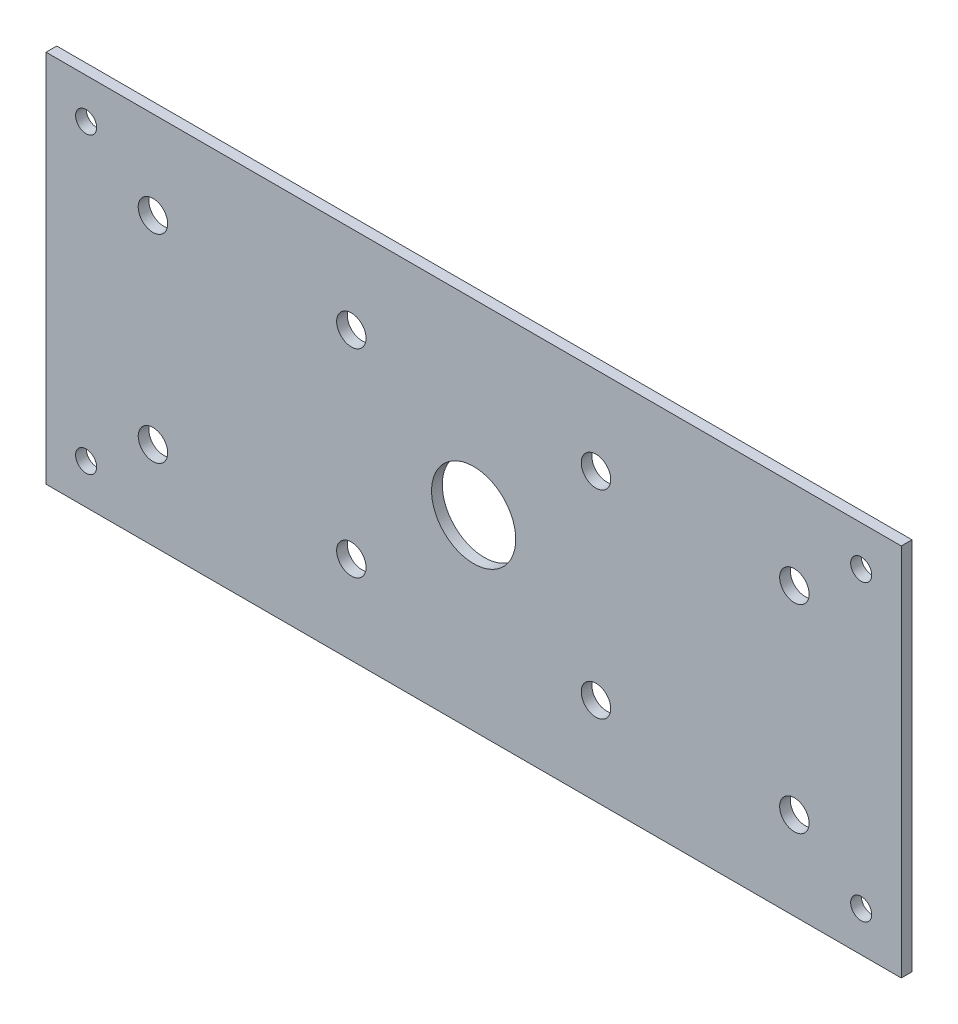
ISO-10303-21;
HEADER;
FILE_DESCRIPTION(('STEP AP214'),'2;1');
FILE_NAME('part.step','',(''),(''),'','','');
FILE_SCHEMA(('AUTOMOTIVE_DESIGN { 1 0 10303 214 1 1 1 1 }'));
ENDSEC;
DATA;
#1=APPLICATION_CONTEXT('core data for automotive mechanical design processes');
#2=APPLICATION_PROTOCOL_DEFINITION('international standard','automotive_design',2000,#1);
#3=PRODUCT_CONTEXT('',#1,'mechanical');
#4=PRODUCT('Part','Part','',(#3));
#5=PRODUCT_RELATED_PRODUCT_CATEGORY('part','',(#4));
#6=PRODUCT_DEFINITION_FORMATION('','',#4);
#7=PRODUCT_DEFINITION_CONTEXT('part definition',#1,'design');
#8=PRODUCT_DEFINITION('design','',#6,#7);
#9=PRODUCT_DEFINITION_SHAPE('','',#8);
#10=(LENGTH_UNIT() NAMED_UNIT(*) SI_UNIT(.MILLI.,.METRE.));
#11=(NAMED_UNIT(*) PLANE_ANGLE_UNIT() SI_UNIT($,.RADIAN.));
#12=(NAMED_UNIT(*) SI_UNIT($,.STERADIAN.) SOLID_ANGLE_UNIT());
#13=UNCERTAINTY_MEASURE_WITH_UNIT(LENGTH_MEASURE(1.E-05),#10,'distance_accuracy_value','');
#14=(GEOMETRIC_REPRESENTATION_CONTEXT(3) GLOBAL_UNCERTAINTY_ASSIGNED_CONTEXT((#13)) GLOBAL_UNIT_ASSIGNED_CONTEXT((#10,
#11,#12)) REPRESENTATION_CONTEXT('',''));
#15=CARTESIAN_POINT('',(0.,0.,0.));
#16=DIRECTION('',(0.,0.,1.));
#17=DIRECTION('',(1.,0.,0.));
#18=AXIS2_PLACEMENT_3D('',#15,#16,#17);
#19=CARTESIAN_POINT('',(0.,0.,1.27));
#20=DIRECTION('',(0.,0.,-1.));
#21=DIRECTION('',(-1.,0.,0.));
#22=AXIS2_PLACEMENT_3D('',#19,#20,#21);
#23=PLANE('',#22);
#24=CARTESIAN_POINT('',(-92.075,34.925,1.27));
#25=DIRECTION('',(0.,0.,1.));
#26=DIRECTION('',(1.,0.,0.));
#27=AXIS2_PLACEMENT_3D('',#24,#25,#26);
#28=CIRCLE('',#27,2.5);
#29=CARTESIAN_POINT('',(-89.575,34.925,1.27));
#30=VERTEX_POINT('',#29);
#31=EDGE_CURVE('E219',#30,#30,#28,.T.);
#32=ORIENTED_EDGE('',*,*,#31,.F.);
#33=EDGE_LOOP('',(#32));
#34=FACE_BOUND('',#33,.T.);
#35=CARTESIAN_POINT('',(92.075,-34.925,1.27));
#36=DIRECTION('',(0.,0.,1.));
#37=DIRECTION('',(1.,0.,0.));
#38=AXIS2_PLACEMENT_3D('',#35,#36,#37);
#39=CIRCLE('',#38,2.5);
#40=CARTESIAN_POINT('',(94.575,-34.925,1.27));
#41=VERTEX_POINT('',#40);
#42=EDGE_CURVE('E210',#41,#41,#39,.T.);
#43=ORIENTED_EDGE('',*,*,#42,.F.);
#44=EDGE_LOOP('',(#43));
#45=FACE_BOUND('',#44,.T.);
#46=CARTESIAN_POINT('',(92.075,34.925,1.27));
#47=DIRECTION('',(0.,0.,1.));
#48=DIRECTION('',(1.,0.,0.));
#49=AXIS2_PLACEMENT_3D('',#46,#47,#48);
#50=CIRCLE('',#49,2.50000000000001);
#51=CARTESIAN_POINT('',(94.575,34.925,1.27));
#52=VERTEX_POINT('',#51);
#53=EDGE_CURVE('E226',#52,#52,#50,.T.);
#54=ORIENTED_EDGE('',*,*,#53,.F.);
#55=EDGE_LOOP('',(#54));
#56=FACE_BOUND('',#55,.T.);
#57=CARTESIAN_POINT('',(-92.075,-34.925,1.27));
#58=DIRECTION('',(0.,0.,1.));
#59=DIRECTION('',(1.,0.,0.));
#60=AXIS2_PLACEMENT_3D('',#57,#58,#59);
#61=CIRCLE('',#60,2.5);
#62=CARTESIAN_POINT('',(-89.575,-34.925,1.27));
#63=VERTEX_POINT('',#62);
#64=EDGE_CURVE('E202',#63,#63,#61,.T.);
#65=ORIENTED_EDGE('',*,*,#64,.F.);
#66=EDGE_LOOP('',(#65));
#67=FACE_BOUND('',#66,.T.);
#68=DIRECTION('',(0.,1.,0.));
#69=VECTOR('',#68,1.);
#70=CARTESIAN_POINT('',(101.6,-44.45,1.27));
#71=LINE('',#70,#69);
#72=CARTESIAN_POINT('',(101.6,-44.45,1.27));
#73=VERTEX_POINT('',#72);
#74=CARTESIAN_POINT('',(101.6,44.45,1.27));
#75=VERTEX_POINT('',#74);
#76=EDGE_CURVE('E92',#73,#75,#71,.T.);
#77=ORIENTED_EDGE('',*,*,#76,.T.);
#78=DIRECTION('',(-1.,0.,0.));
#79=VECTOR('',#78,1.);
#80=CARTESIAN_POINT('',(-101.6,44.45,1.27));
#81=LINE('',#80,#79);
#82=CARTESIAN_POINT('',(-101.6,44.45,1.27));
#83=VERTEX_POINT('',#82);
#84=EDGE_CURVE('E87',#75,#83,#81,.T.);
#85=ORIENTED_EDGE('',*,*,#84,.T.);
#86=DIRECTION('',(0.,-1.,0.));
#87=VECTOR('',#86,1.);
#88=CARTESIAN_POINT('',(-101.6,-44.45,1.27));
#89=LINE('',#88,#87);
#90=CARTESIAN_POINT('',(-101.6,-44.45,1.27));
#91=VERTEX_POINT('',#90);
#92=EDGE_CURVE('E90',#83,#91,#89,.T.);
#93=ORIENTED_EDGE('',*,*,#92,.T.);
#94=DIRECTION('',(1.,0.,0.));
#95=VECTOR('',#94,1.);
#96=CARTESIAN_POINT('',(-101.6,-44.45,1.27));
#97=LINE('',#96,#95);
#98=EDGE_CURVE('E57',#91,#73,#97,.T.);
#99=ORIENTED_EDGE('',*,*,#98,.T.);
#100=EDGE_LOOP('',(#77,#85,#93,#99));
#101=FACE_BOUND('',#100,.T.);
#102=CARTESIAN_POINT('',(-76.2,23.57,1.27));
#103=DIRECTION('',(0.,0.,1.));
#104=DIRECTION('',(1.,0.,0.));
#105=AXIS2_PLACEMENT_3D('',#102,#103,#104);
#106=CIRCLE('',#105,3.50000000000001);
#107=CARTESIAN_POINT('',(-72.7,23.57,1.27));
#108=VERTEX_POINT('',#107);
#109=EDGE_CURVE('E112',#108,#108,#106,.T.);
#110=ORIENTED_EDGE('',*,*,#109,.F.);
#111=EDGE_LOOP('',(#110));
#112=FACE_BOUND('',#111,.T.);
#113=CARTESIAN_POINT('',(-29.06,23.57,1.27));
#114=DIRECTION('',(0.,0.,1.));
#115=DIRECTION('',(1.,0.,0.));
#116=AXIS2_PLACEMENT_3D('',#113,#114,#115);
#117=CIRCLE('',#116,3.5);
#118=CARTESIAN_POINT('',(-25.56,23.57,1.27));
#119=VERTEX_POINT('',#118);
#120=EDGE_CURVE('E134',#119,#119,#117,.T.);
#121=ORIENTED_EDGE('',*,*,#120,.F.);
#122=EDGE_LOOP('',(#121));
#123=FACE_BOUND('',#122,.T.);
#124=CARTESIAN_POINT('',(-29.06,-23.57,1.27));
#125=DIRECTION('',(0.,0.,1.));
#126=DIRECTION('',(1.,0.,0.));
#127=AXIS2_PLACEMENT_3D('',#124,#125,#126);
#128=CIRCLE('',#127,3.5);
#129=CARTESIAN_POINT('',(-25.56,-23.57,1.27));
#130=VERTEX_POINT('',#129);
#131=EDGE_CURVE('E142',#130,#130,#128,.T.);
#132=ORIENTED_EDGE('',*,*,#131,.F.);
#133=EDGE_LOOP('',(#132));
#134=FACE_BOUND('',#133,.T.);
#135=CARTESIAN_POINT('',(-76.2,-23.57,1.27));
#136=DIRECTION('',(0.,0.,1.));
#137=DIRECTION('',(1.,0.,0.));
#138=AXIS2_PLACEMENT_3D('',#135,#136,#137);
#139=CIRCLE('',#138,3.50000000000001);
#140=CARTESIAN_POINT('',(-72.7,-23.57,1.27));
#141=VERTEX_POINT('',#140);
#142=EDGE_CURVE('E150',#141,#141,#139,.T.);
#143=ORIENTED_EDGE('',*,*,#142,.F.);
#144=EDGE_LOOP('',(#143));
#145=FACE_BOUND('',#144,.T.);
#146=CARTESIAN_POINT('',(29.06,-23.57,1.27));
#147=DIRECTION('',(0.,0.,1.));
#148=DIRECTION('',(1.,0.,0.));
#149=AXIS2_PLACEMENT_3D('',#146,#147,#148);
#150=CIRCLE('',#149,3.5);
#151=CARTESIAN_POINT('',(32.56,-23.57,1.27));
#152=VERTEX_POINT('',#151);
#153=EDGE_CURVE('E158',#152,#152,#150,.T.);
#154=ORIENTED_EDGE('',*,*,#153,.F.);
#155=EDGE_LOOP('',(#154));
#156=FACE_BOUND('',#155,.T.);
#157=CARTESIAN_POINT('',(76.2,-23.57,1.27));
#158=DIRECTION('',(0.,0.,1.));
#159=DIRECTION('',(1.,0.,0.));
#160=AXIS2_PLACEMENT_3D('',#157,#158,#159);
#161=CIRCLE('',#160,3.50000000000001);
#162=CARTESIAN_POINT('',(79.7,-23.57,1.27));
#163=VERTEX_POINT('',#162);
#164=EDGE_CURVE('E166',#163,#163,#161,.T.);
#165=ORIENTED_EDGE('',*,*,#164,.F.);
#166=EDGE_LOOP('',(#165));
#167=FACE_BOUND('',#166,.T.);
#168=CARTESIAN_POINT('',(76.2,23.57,1.27));
#169=DIRECTION('',(0.,0.,1.));
#170=DIRECTION('',(1.,0.,0.));
#171=AXIS2_PLACEMENT_3D('',#168,#169,#170);
#172=CIRCLE('',#171,3.50000000000001);
#173=CARTESIAN_POINT('',(79.7,23.57,1.27));
#174=VERTEX_POINT('',#173);
#175=EDGE_CURVE('E174',#174,#174,#172,.T.);
#176=ORIENTED_EDGE('',*,*,#175,.F.);
#177=EDGE_LOOP('',(#176));
#178=FACE_BOUND('',#177,.T.);
#179=CARTESIAN_POINT('',(29.06,23.57,1.27));
#180=DIRECTION('',(0.,0.,1.));
#181=DIRECTION('',(1.,0.,0.));
#182=AXIS2_PLACEMENT_3D('',#179,#180,#181);
#183=CIRCLE('',#182,3.5);
#184=CARTESIAN_POINT('',(32.56,23.57,1.27));
#185=VERTEX_POINT('',#184);
#186=EDGE_CURVE('E182',#185,#185,#183,.T.);
#187=ORIENTED_EDGE('',*,*,#186,.F.);
#188=EDGE_LOOP('',(#187));
#189=FACE_BOUND('',#188,.T.);
#190=CARTESIAN_POINT('',(0.,0.,1.27));
#191=DIRECTION('',(0.,0.,1.));
#192=DIRECTION('',(1.,0.,0.));
#193=AXIS2_PLACEMENT_3D('',#190,#191,#192);
#194=CIRCLE('',#193,10.);
#195=CARTESIAN_POINT('',(9.99999999999999,0.,1.27));
#196=VERTEX_POINT('',#195);
#197=EDGE_CURVE('E190',#196,#196,#194,.T.);
#198=ORIENTED_EDGE('',*,*,#197,.F.);
#199=EDGE_LOOP('',(#198));
#200=FACE_BOUND('',#199,.T.);
#201=ADVANCED_FACE('F39',(#34,#45,#56,#67,#101,#112,#123,#134,#145,#156,#167,#178,#189,#200),
#23,.F.);
#202=CARTESIAN_POINT('',(0.,0.,-1.27));
#203=DIRECTION('',(0.,0.,-1.));
#204=DIRECTION('',(-1.,0.,0.));
#205=AXIS2_PLACEMENT_3D('',#202,#203,#204);
#206=PLANE('',#205);
#207=CARTESIAN_POINT('',(-92.075,34.925,-1.27));
#208=DIRECTION('',(0.,0.,1.));
#209=DIRECTION('',(1.,0.,0.));
#210=AXIS2_PLACEMENT_3D('',#207,#208,#209);
#211=CIRCLE('',#210,2.5);
#212=CARTESIAN_POINT('',(-89.575,34.925,-1.27));
#213=VERTEX_POINT('',#212);
#214=EDGE_CURVE('E206',#213,#213,#211,.T.);
#215=ORIENTED_EDGE('',*,*,#214,.T.);
#216=EDGE_LOOP('',(#215));
#217=FACE_BOUND('',#216,.T.);
#218=CARTESIAN_POINT('',(92.075,-34.925,-1.27));
#219=DIRECTION('',(0.,0.,1.));
#220=DIRECTION('',(1.,0.,0.));
#221=AXIS2_PLACEMENT_3D('',#218,#219,#220);
#222=CIRCLE('',#221,2.5);
#223=CARTESIAN_POINT('',(94.575,-34.925,-1.27));
#224=VERTEX_POINT('',#223);
#225=EDGE_CURVE('E214',#224,#224,#222,.T.);
#226=ORIENTED_EDGE('',*,*,#225,.T.);
#227=EDGE_LOOP('',(#226));
#228=FACE_BOUND('',#227,.T.);
#229=CARTESIAN_POINT('',(92.075,34.925,-1.27));
#230=DIRECTION('',(0.,0.,1.));
#231=DIRECTION('',(1.,0.,0.));
#232=AXIS2_PLACEMENT_3D('',#229,#230,#231);
#233=CIRCLE('',#232,2.50000000000001);
#234=CARTESIAN_POINT('',(94.575,34.925,-1.27));
#235=VERTEX_POINT('',#234);
#236=EDGE_CURVE('E215',#235,#235,#233,.T.);
#237=ORIENTED_EDGE('',*,*,#236,.T.);
#238=EDGE_LOOP('',(#237));
#239=FACE_BOUND('',#238,.T.);
#240=CARTESIAN_POINT('',(-92.075,-34.925,-1.27));
#241=DIRECTION('',(0.,0.,1.));
#242=DIRECTION('',(1.,0.,0.));
#243=AXIS2_PLACEMENT_3D('',#240,#241,#242);
#244=CIRCLE('',#243,2.5);
#245=CARTESIAN_POINT('',(-89.575,-34.925,-1.27));
#246=VERTEX_POINT('',#245);
#247=EDGE_CURVE('E198',#246,#246,#244,.T.);
#248=ORIENTED_EDGE('',*,*,#247,.T.);
#249=EDGE_LOOP('',(#248));
#250=FACE_BOUND('',#249,.T.);
#251=CARTESIAN_POINT('',(29.06,23.57,-1.27));
#252=DIRECTION('',(0.,0.,1.));
#253=DIRECTION('',(1.,0.,0.));
#254=AXIS2_PLACEMENT_3D('',#251,#252,#253);
#255=CIRCLE('',#254,3.5);
#256=CARTESIAN_POINT('',(32.56,23.57,-1.27));
#257=VERTEX_POINT('',#256);
#258=EDGE_CURVE('E186',#257,#257,#255,.T.);
#259=ORIENTED_EDGE('',*,*,#258,.T.);
#260=EDGE_LOOP('',(#259));
#261=FACE_BOUND('',#260,.T.);
#262=CARTESIAN_POINT('',(76.2,-23.57,-1.27));
#263=DIRECTION('',(0.,0.,1.));
#264=DIRECTION('',(1.,0.,0.));
#265=AXIS2_PLACEMENT_3D('',#262,#263,#264);
#266=CIRCLE('',#265,3.50000000000001);
#267=CARTESIAN_POINT('',(79.7,-23.57,-1.27));
#268=VERTEX_POINT('',#267);
#269=EDGE_CURVE('E170',#268,#268,#266,.T.);
#270=ORIENTED_EDGE('',*,*,#269,.T.);
#271=EDGE_LOOP('',(#270));
#272=FACE_BOUND('',#271,.T.);
#273=CARTESIAN_POINT('',(-76.2,-23.57,-1.27));
#274=DIRECTION('',(0.,0.,1.));
#275=DIRECTION('',(1.,0.,0.));
#276=AXIS2_PLACEMENT_3D('',#273,#274,#275);
#277=CIRCLE('',#276,3.50000000000001);
#278=CARTESIAN_POINT('',(-72.7,-23.57,-1.27));
#279=VERTEX_POINT('',#278);
#280=EDGE_CURVE('E154',#279,#279,#277,.T.);
#281=ORIENTED_EDGE('',*,*,#280,.T.);
#282=EDGE_LOOP('',(#281));
#283=FACE_BOUND('',#282,.T.);
#284=CARTESIAN_POINT('',(-29.06,23.57,-1.27));
#285=DIRECTION('',(0.,0.,1.));
#286=DIRECTION('',(1.,0.,0.));
#287=AXIS2_PLACEMENT_3D('',#284,#285,#286);
#288=CIRCLE('',#287,3.5);
#289=CARTESIAN_POINT('',(-25.56,23.57,-1.27));
#290=VERTEX_POINT('',#289);
#291=EDGE_CURVE('E138',#290,#290,#288,.T.);
#292=ORIENTED_EDGE('',*,*,#291,.T.);
#293=EDGE_LOOP('',(#292));
#294=FACE_BOUND('',#293,.T.);
#295=DIRECTION('',(0.,1.,0.));
#296=VECTOR('',#295,1.);
#297=CARTESIAN_POINT('',(101.6,-44.45,-1.27));
#298=LINE('',#297,#296);
#299=CARTESIAN_POINT('',(101.6,-44.45,-1.27));
#300=VERTEX_POINT('',#299);
#301=CARTESIAN_POINT('',(101.6,44.45,-1.27));
#302=VERTEX_POINT('',#301);
#303=EDGE_CURVE('E108',#300,#302,#298,.T.);
#304=ORIENTED_EDGE('',*,*,#303,.F.);
#305=DIRECTION('',(1.,0.,0.));
#306=VECTOR('',#305,1.);
#307=CARTESIAN_POINT('',(-101.6,-44.45,-1.27));
#308=LINE('',#307,#306);
#309=CARTESIAN_POINT('',(-101.6,-44.45,-1.27));
#310=VERTEX_POINT('',#309);
#311=EDGE_CURVE('E80',#310,#300,#308,.T.);
#312=ORIENTED_EDGE('',*,*,#311,.F.);
#313=DIRECTION('',(0.,-1.,0.));
#314=VECTOR('',#313,1.);
#315=CARTESIAN_POINT('',(-101.6,-44.45,-1.27));
#316=LINE('',#315,#314);
#317=CARTESIAN_POINT('',(-101.6,44.45,-1.27));
#318=VERTEX_POINT('',#317);
#319=EDGE_CURVE('E74',#318,#310,#316,.T.);
#320=ORIENTED_EDGE('',*,*,#319,.F.);
#321=DIRECTION('',(-1.,0.,0.));
#322=VECTOR('',#321,1.);
#323=CARTESIAN_POINT('',(-101.6,44.45,-1.27));
#324=LINE('',#323,#322);
#325=EDGE_CURVE('E97',#302,#318,#324,.T.);
#326=ORIENTED_EDGE('',*,*,#325,.F.);
#327=EDGE_LOOP('',(#304,#312,#320,#326));
#328=FACE_BOUND('',#327,.T.);
#329=CARTESIAN_POINT('',(-76.2,23.57,-1.27));
#330=DIRECTION('',(0.,0.,1.));
#331=DIRECTION('',(1.,0.,0.));
#332=AXIS2_PLACEMENT_3D('',#329,#330,#331);
#333=CIRCLE('',#332,3.50000000000001);
#334=CARTESIAN_POINT('',(-72.7,23.57,-1.27));
#335=VERTEX_POINT('',#334);
#336=EDGE_CURVE('E130',#335,#335,#333,.T.);
#337=ORIENTED_EDGE('',*,*,#336,.T.);
#338=EDGE_LOOP('',(#337));
#339=FACE_BOUND('',#338,.T.);
#340=CARTESIAN_POINT('',(-29.06,-23.57,-1.27));
#341=DIRECTION('',(0.,0.,1.));
#342=DIRECTION('',(1.,0.,0.));
#343=AXIS2_PLACEMENT_3D('',#340,#341,#342);
#344=CIRCLE('',#343,3.5);
#345=CARTESIAN_POINT('',(-25.56,-23.57,-1.27));
#346=VERTEX_POINT('',#345);
#347=EDGE_CURVE('E146',#346,#346,#344,.T.);
#348=ORIENTED_EDGE('',*,*,#347,.T.);
#349=EDGE_LOOP('',(#348));
#350=FACE_BOUND('',#349,.T.);
#351=CARTESIAN_POINT('',(29.06,-23.57,-1.27));
#352=DIRECTION('',(0.,0.,1.));
#353=DIRECTION('',(1.,0.,0.));
#354=AXIS2_PLACEMENT_3D('',#351,#352,#353);
#355=CIRCLE('',#354,3.5);
#356=CARTESIAN_POINT('',(32.56,-23.57,-1.27));
#357=VERTEX_POINT('',#356);
#358=EDGE_CURVE('E162',#357,#357,#355,.T.);
#359=ORIENTED_EDGE('',*,*,#358,.T.);
#360=EDGE_LOOP('',(#359));
#361=FACE_BOUND('',#360,.T.);
#362=CARTESIAN_POINT('',(76.2,23.57,-1.27));
#363=DIRECTION('',(0.,0.,1.));
#364=DIRECTION('',(1.,0.,0.));
#365=AXIS2_PLACEMENT_3D('',#362,#363,#364);
#366=CIRCLE('',#365,3.50000000000001);
#367=CARTESIAN_POINT('',(79.7,23.57,-1.27));
#368=VERTEX_POINT('',#367);
#369=EDGE_CURVE('E178',#368,#368,#366,.T.);
#370=ORIENTED_EDGE('',*,*,#369,.T.);
#371=EDGE_LOOP('',(#370));
#372=FACE_BOUND('',#371,.T.);
#373=CARTESIAN_POINT('',(0.,0.,-1.27));
#374=DIRECTION('',(0.,0.,1.));
#375=DIRECTION('',(1.,0.,0.));
#376=AXIS2_PLACEMENT_3D('',#373,#374,#375);
#377=CIRCLE('',#376,10.);
#378=CARTESIAN_POINT('',(9.99999999999999,0.,-1.27));
#379=VERTEX_POINT('',#378);
#380=EDGE_CURVE('E194',#379,#379,#377,.T.);
#381=ORIENTED_EDGE('',*,*,#380,.T.);
#382=EDGE_LOOP('',(#381));
#383=FACE_BOUND('',#382,.T.);
#384=ADVANCED_FACE('F125',(#217,#228,#239,#250,#261,#272,#283,#294,#328,#339,#350,#361,#372,
#383),#206,.T.);
#385=CARTESIAN_POINT('',(101.6,-44.45,1.27));
#386=DIRECTION('',(-1.,0.,0.));
#387=DIRECTION('',(0.,0.,1.));
#388=AXIS2_PLACEMENT_3D('',#385,#386,#387);
#389=PLANE('',#388);
#390=ORIENTED_EDGE('',*,*,#303,.T.);
#391=DIRECTION('',(0.,0.,-1.));
#392=VECTOR('',#391,1.);
#393=CARTESIAN_POINT('',(101.6,44.45,1.27));
#394=LINE('',#393,#392);
#395=EDGE_CURVE('E11',#75,#302,#394,.T.);
#396=ORIENTED_EDGE('',*,*,#395,.F.);
#397=ORIENTED_EDGE('',*,*,#76,.F.);
#398=DIRECTION('',(0.,0.,-1.));
#399=VECTOR('',#398,1.);
#400=CARTESIAN_POINT('',(101.6,-44.45,1.27));
#401=LINE('',#400,#399);
#402=EDGE_CURVE('E104',#73,#300,#401,.T.);
#403=ORIENTED_EDGE('',*,*,#402,.T.);
#404=EDGE_LOOP('',(#390,#396,#397,#403));
#405=FACE_BOUND('',#404,.T.);
#406=ADVANCED_FACE('F41',(#405),#389,.F.);
#407=CARTESIAN_POINT('',(-101.6,44.45,1.27));
#408=DIRECTION('',(0.,-1.,0.));
#409=DIRECTION('',(0.,0.,-1.));
#410=AXIS2_PLACEMENT_3D('',#407,#408,#409);
#411=PLANE('',#410);
#412=ORIENTED_EDGE('',*,*,#325,.T.);
#413=DIRECTION('',(0.,0.,-1.));
#414=VECTOR('',#413,1.);
#415=CARTESIAN_POINT('',(-101.6,44.45,1.27));
#416=LINE('',#415,#414);
#417=EDGE_CURVE('E49',#83,#318,#416,.T.);
#418=ORIENTED_EDGE('',*,*,#417,.F.);
#419=ORIENTED_EDGE('',*,*,#84,.F.);
#420=ORIENTED_EDGE('',*,*,#395,.T.);
#421=EDGE_LOOP('',(#412,#418,#419,#420));
#422=FACE_BOUND('',#421,.T.);
#423=ADVANCED_FACE('F96',(#422),#411,.F.);
#424=CARTESIAN_POINT('',(-101.6,-44.45,1.27));
#425=DIRECTION('',(1.,0.,0.));
#426=DIRECTION('',(0.,0.,-1.));
#427=AXIS2_PLACEMENT_3D('',#424,#425,#426);
#428=PLANE('',#427);
#429=ORIENTED_EDGE('',*,*,#319,.T.);
#430=DIRECTION('',(0.,0.,-1.));
#431=VECTOR('',#430,1.);
#432=CARTESIAN_POINT('',(-101.6,-44.45,1.27));
#433=LINE('',#432,#431);
#434=EDGE_CURVE('E99',#91,#310,#433,.T.);
#435=ORIENTED_EDGE('',*,*,#434,.F.);
#436=ORIENTED_EDGE('',*,*,#92,.F.);
#437=ORIENTED_EDGE('',*,*,#417,.T.);
#438=EDGE_LOOP('',(#429,#435,#436,#437));
#439=FACE_BOUND('',#438,.T.);
#440=ADVANCED_FACE('F100',(#439),#428,.F.);
#441=CARTESIAN_POINT('',(-101.6,-44.45,1.27));
#442=DIRECTION('',(0.,1.,0.));
#443=DIRECTION('',(0.,0.,1.));
#444=AXIS2_PLACEMENT_3D('',#441,#442,#443);
#445=PLANE('',#444);
#446=ORIENTED_EDGE('',*,*,#311,.T.);
#447=ORIENTED_EDGE('',*,*,#402,.F.);
#448=ORIENTED_EDGE('',*,*,#98,.F.);
#449=ORIENTED_EDGE('',*,*,#434,.T.);
#450=EDGE_LOOP('',(#446,#447,#448,#449));
#451=FACE_BOUND('',#450,.T.);
#452=ADVANCED_FACE('F122',(#451),#445,.F.);
#453=CARTESIAN_POINT('',(-76.2,23.57,1.27));
#454=DIRECTION('',(0.,0.,-1.));
#455=DIRECTION('',(-1.,0.,0.));
#456=AXIS2_PLACEMENT_3D('',#453,#454,#455);
#457=CYLINDRICAL_SURFACE('',#456,3.50000000000001);
#458=ORIENTED_EDGE('',*,*,#109,.T.);
#459=EDGE_LOOP('',(#458));
#460=FACE_BOUND('',#459,.T.);
#461=ORIENTED_EDGE('',*,*,#336,.F.);
#462=EDGE_LOOP('',(#461));
#463=FACE_BOUND('',#462,.T.);
#464=ADVANCED_FACE('F290',(#460,#463),#457,.F.);
#465=CARTESIAN_POINT('',(-29.06,23.57,1.27));
#466=DIRECTION('',(0.,0.,-1.));
#467=DIRECTION('',(-1.,0.,0.));
#468=AXIS2_PLACEMENT_3D('',#465,#466,#467);
#469=CYLINDRICAL_SURFACE('',#468,3.5);
#470=ORIENTED_EDGE('',*,*,#120,.T.);
#471=EDGE_LOOP('',(#470));
#472=FACE_BOUND('',#471,.T.);
#473=ORIENTED_EDGE('',*,*,#291,.F.);
#474=EDGE_LOOP('',(#473));
#475=FACE_BOUND('',#474,.T.);
#476=ADVANCED_FACE('F286',(#472,#475),#469,.F.);
#477=CARTESIAN_POINT('',(-29.06,-23.57,1.27));
#478=DIRECTION('',(0.,0.,-1.));
#479=DIRECTION('',(-1.,0.,0.));
#480=AXIS2_PLACEMENT_3D('',#477,#478,#479);
#481=CYLINDRICAL_SURFACE('',#480,3.5);
#482=ORIENTED_EDGE('',*,*,#131,.T.);
#483=EDGE_LOOP('',(#482));
#484=FACE_BOUND('',#483,.T.);
#485=ORIENTED_EDGE('',*,*,#347,.F.);
#486=EDGE_LOOP('',(#485));
#487=FACE_BOUND('',#486,.T.);
#488=ADVANCED_FACE('F282',(#484,#487),#481,.F.);
#489=CARTESIAN_POINT('',(-76.2,-23.57,1.27));
#490=DIRECTION('',(0.,0.,-1.));
#491=DIRECTION('',(-1.,0.,0.));
#492=AXIS2_PLACEMENT_3D('',#489,#490,#491);
#493=CYLINDRICAL_SURFACE('',#492,3.50000000000001);
#494=ORIENTED_EDGE('',*,*,#142,.T.);
#495=EDGE_LOOP('',(#494));
#496=FACE_BOUND('',#495,.T.);
#497=ORIENTED_EDGE('',*,*,#280,.F.);
#498=EDGE_LOOP('',(#497));
#499=FACE_BOUND('',#498,.T.);
#500=ADVANCED_FACE('F278',(#496,#499),#493,.F.);
#501=CARTESIAN_POINT('',(29.06,-23.57,1.27));
#502=DIRECTION('',(0.,0.,-1.));
#503=DIRECTION('',(-1.,0.,0.));
#504=AXIS2_PLACEMENT_3D('',#501,#502,#503);
#505=CYLINDRICAL_SURFACE('',#504,3.5);
#506=ORIENTED_EDGE('',*,*,#153,.T.);
#507=EDGE_LOOP('',(#506));
#508=FACE_BOUND('',#507,.T.);
#509=ORIENTED_EDGE('',*,*,#358,.F.);
#510=EDGE_LOOP('',(#509));
#511=FACE_BOUND('',#510,.T.);
#512=ADVANCED_FACE('F274',(#508,#511),#505,.F.);
#513=CARTESIAN_POINT('',(76.2,-23.57,1.27));
#514=DIRECTION('',(0.,0.,-1.));
#515=DIRECTION('',(-1.,0.,0.));
#516=AXIS2_PLACEMENT_3D('',#513,#514,#515);
#517=CYLINDRICAL_SURFACE('',#516,3.50000000000001);
#518=ORIENTED_EDGE('',*,*,#164,.T.);
#519=EDGE_LOOP('',(#518));
#520=FACE_BOUND('',#519,.T.);
#521=ORIENTED_EDGE('',*,*,#269,.F.);
#522=EDGE_LOOP('',(#521));
#523=FACE_BOUND('',#522,.T.);
#524=ADVANCED_FACE('F270',(#520,#523),#517,.F.);
#525=CARTESIAN_POINT('',(76.2,23.57,1.27));
#526=DIRECTION('',(0.,0.,-1.));
#527=DIRECTION('',(-1.,0.,0.));
#528=AXIS2_PLACEMENT_3D('',#525,#526,#527);
#529=CYLINDRICAL_SURFACE('',#528,3.50000000000001);
#530=ORIENTED_EDGE('',*,*,#175,.T.);
#531=EDGE_LOOP('',(#530));
#532=FACE_BOUND('',#531,.T.);
#533=ORIENTED_EDGE('',*,*,#369,.F.);
#534=EDGE_LOOP('',(#533));
#535=FACE_BOUND('',#534,.T.);
#536=ADVANCED_FACE('F266',(#532,#535),#529,.F.);
#537=CARTESIAN_POINT('',(29.06,23.57,1.27));
#538=DIRECTION('',(0.,0.,-1.));
#539=DIRECTION('',(-1.,0.,0.));
#540=AXIS2_PLACEMENT_3D('',#537,#538,#539);
#541=CYLINDRICAL_SURFACE('',#540,3.5);
#542=ORIENTED_EDGE('',*,*,#186,.T.);
#543=EDGE_LOOP('',(#542));
#544=FACE_BOUND('',#543,.T.);
#545=ORIENTED_EDGE('',*,*,#258,.F.);
#546=EDGE_LOOP('',(#545));
#547=FACE_BOUND('',#546,.T.);
#548=ADVANCED_FACE('F257',(#544,#547),#541,.F.);
#549=CARTESIAN_POINT('',(0.,0.,1.27));
#550=DIRECTION('',(0.,0.,-1.));
#551=DIRECTION('',(-1.,0.,0.));
#552=AXIS2_PLACEMENT_3D('',#549,#550,#551);
#553=CYLINDRICAL_SURFACE('',#552,10.);
#554=ORIENTED_EDGE('',*,*,#197,.T.);
#555=EDGE_LOOP('',(#554));
#556=FACE_BOUND('',#555,.T.);
#557=ORIENTED_EDGE('',*,*,#380,.F.);
#558=EDGE_LOOP('',(#557));
#559=FACE_BOUND('',#558,.T.);
#560=ADVANCED_FACE('F251',(#556,#559),#553,.F.);
#561=CARTESIAN_POINT('',(-92.075,-34.925,-1.27));
#562=DIRECTION('',(0.,0.,1.));
#563=DIRECTION('',(1.,0.,0.));
#564=AXIS2_PLACEMENT_3D('',#561,#562,#563);
#565=CYLINDRICAL_SURFACE('',#564,2.5);
#566=ORIENTED_EDGE('',*,*,#247,.F.);
#567=EDGE_LOOP('',(#566));
#568=FACE_BOUND('',#567,.T.);
#569=ORIENTED_EDGE('',*,*,#64,.T.);
#570=EDGE_LOOP('',(#569));
#571=FACE_BOUND('',#570,.T.);
#572=ADVANCED_FACE('F240',(#568,#571),#565,.F.);
#573=CARTESIAN_POINT('',(92.075,34.925,-1.27));
#574=DIRECTION('',(0.,0.,1.));
#575=DIRECTION('',(1.,0.,0.));
#576=AXIS2_PLACEMENT_3D('',#573,#574,#575);
#577=CYLINDRICAL_SURFACE('',#576,2.50000000000001);
#578=ORIENTED_EDGE('',*,*,#236,.F.);
#579=EDGE_LOOP('',(#578));
#580=FACE_BOUND('',#579,.T.);
#581=ORIENTED_EDGE('',*,*,#53,.T.);
#582=EDGE_LOOP('',(#581));
#583=FACE_BOUND('',#582,.T.);
#584=ADVANCED_FACE('F236',(#580,#583),#577,.F.);
#585=CARTESIAN_POINT('',(92.075,-34.925,-1.27));
#586=DIRECTION('',(0.,0.,1.));
#587=DIRECTION('',(1.,0.,0.));
#588=AXIS2_PLACEMENT_3D('',#585,#586,#587);
#589=CYLINDRICAL_SURFACE('',#588,2.5);
#590=ORIENTED_EDGE('',*,*,#225,.F.);
#591=EDGE_LOOP('',(#590));
#592=FACE_BOUND('',#591,.T.);
#593=ORIENTED_EDGE('',*,*,#42,.T.);
#594=EDGE_LOOP('',(#593));
#595=FACE_BOUND('',#594,.T.);
#596=ADVANCED_FACE('F239',(#592,#595),#589,.F.);
#597=CARTESIAN_POINT('',(-92.075,34.925,-1.27));
#598=DIRECTION('',(0.,0.,1.));
#599=DIRECTION('',(1.,0.,0.));
#600=AXIS2_PLACEMENT_3D('',#597,#598,#599);
#601=CYLINDRICAL_SURFACE('',#600,2.5);
#602=ORIENTED_EDGE('',*,*,#214,.F.);
#603=EDGE_LOOP('',(#602));
#604=FACE_BOUND('',#603,.T.);
#605=ORIENTED_EDGE('',*,*,#31,.T.);
#606=EDGE_LOOP('',(#605));
#607=FACE_BOUND('',#606,.T.);
#608=ADVANCED_FACE('F408',(#604,#607),#601,.F.);
#609=CLOSED_SHELL('',(#201,#384,#406,#423,#440,#452,#464,#476,#488,#500,#512,#524,#536,#548,
#560,#572,#584,#596,#608));
#610=MANIFOLD_SOLID_BREP('B2',#609);
#611=ADVANCED_BREP_SHAPE_REPRESENTATION('',(#18,#610),#14);
#612=SHAPE_DEFINITION_REPRESENTATION(#9,#611);
ENDSEC;
END-ISO-10303-21;
